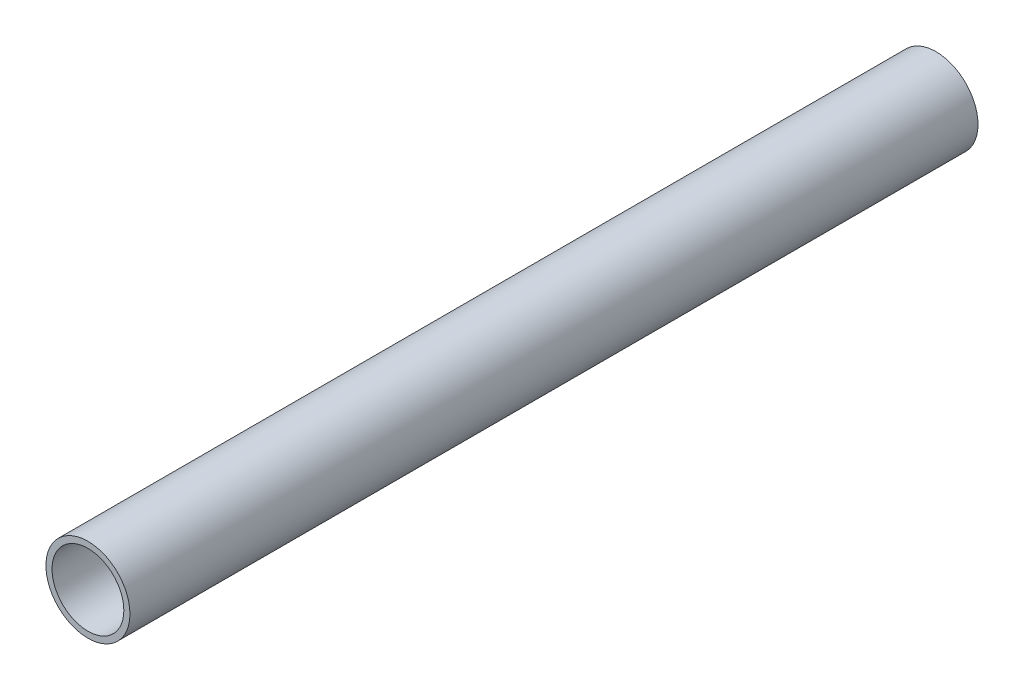
ISO-10303-21;
HEADER;
FILE_DESCRIPTION(('STEP AP214'),'2;1');
FILE_NAME('part.step','',(''),(''),'','','');
FILE_SCHEMA(('AUTOMOTIVE_DESIGN { 1 0 10303 214 1 1 1 1 }'));
ENDSEC;
DATA;
#1=APPLICATION_CONTEXT('core data for automotive mechanical design processes');
#2=APPLICATION_PROTOCOL_DEFINITION('international standard','automotive_design',2000,#1);
#3=PRODUCT_CONTEXT('',#1,'mechanical');
#4=PRODUCT('Part','Part','',(#3));
#5=PRODUCT_RELATED_PRODUCT_CATEGORY('part','',(#4));
#6=PRODUCT_DEFINITION_FORMATION('','',#4);
#7=PRODUCT_DEFINITION_CONTEXT('part definition',#1,'design');
#8=PRODUCT_DEFINITION('design','',#6,#7);
#9=PRODUCT_DEFINITION_SHAPE('','',#8);
#10=(LENGTH_UNIT() NAMED_UNIT(*) SI_UNIT(.MILLI.,.METRE.));
#11=(NAMED_UNIT(*) PLANE_ANGLE_UNIT() SI_UNIT($,.RADIAN.));
#12=(NAMED_UNIT(*) SI_UNIT($,.STERADIAN.) SOLID_ANGLE_UNIT());
#13=UNCERTAINTY_MEASURE_WITH_UNIT(LENGTH_MEASURE(1.E-05),#10,'distance_accuracy_value','');
#14=(GEOMETRIC_REPRESENTATION_CONTEXT(3) GLOBAL_UNCERTAINTY_ASSIGNED_CONTEXT((#13)) GLOBAL_UNIT_ASSIGNED_CONTEXT((#10,
#11,#12)) REPRESENTATION_CONTEXT('',''));
#15=CARTESIAN_POINT('',(0.,0.,0.));
#16=DIRECTION('',(0.,0.,1.));
#17=DIRECTION('',(1.,0.,0.));
#18=AXIS2_PLACEMENT_3D('',#15,#16,#17);
#19=CARTESIAN_POINT('',(0.,0.,600.));
#20=DIRECTION('',(0.,0.,1.));
#21=DIRECTION('',(1.,0.,0.));
#22=AXIS2_PLACEMENT_3D('',#19,#20,#21);
#23=PLANE('',#22);
#24=CARTESIAN_POINT('',(0.,0.,600.));
#25=DIRECTION('',(0.,0.,1.));
#26=DIRECTION('',(1.,0.,0.));
#27=AXIS2_PLACEMENT_3D('',#24,#25,#26);
#28=CIRCLE('',#27,29.72);
#29=CARTESIAN_POINT('',(29.72,0.,600.));
#30=VERTEX_POINT('',#29);
#31=EDGE_CURVE('E10',#30,#30,#28,.T.);
#32=ORIENTED_EDGE('',*,*,#31,.T.);
#33=EDGE_LOOP('',(#32));
#34=FACE_BOUND('',#33,.T.);
#35=CARTESIAN_POINT('',(0.,0.,600.));
#36=DIRECTION('',(0.,0.,1.));
#37=DIRECTION('',(1.,0.,0.));
#38=AXIS2_PLACEMENT_3D('',#35,#36,#37);
#39=CIRCLE('',#38,25.4);
#40=CARTESIAN_POINT('',(25.4,0.,600.));
#41=VERTEX_POINT('',#40);
#42=EDGE_CURVE('E48',#41,#41,#39,.T.);
#43=ORIENTED_EDGE('',*,*,#42,.F.);
#44=EDGE_LOOP('',(#43));
#45=FACE_BOUND('',#44,.T.);
#46=ADVANCED_FACE('F37',(#34,#45),#23,.T.);
#47=CARTESIAN_POINT('',(0.,0.,0.));
#48=DIRECTION('',(0.,0.,1.));
#49=DIRECTION('',(1.,0.,0.));
#50=AXIS2_PLACEMENT_3D('',#47,#48,#49);
#51=PLANE('',#50);
#52=CARTESIAN_POINT('',(0.,0.,0.));
#53=DIRECTION('',(0.,0.,1.));
#54=DIRECTION('',(1.,0.,0.));
#55=AXIS2_PLACEMENT_3D('',#52,#53,#54);
#56=CIRCLE('',#55,29.72);
#57=CARTESIAN_POINT('',(29.72,0.,0.));
#58=VERTEX_POINT('',#57);
#59=EDGE_CURVE('E41',#58,#58,#56,.T.);
#60=ORIENTED_EDGE('',*,*,#59,.F.);
#61=EDGE_LOOP('',(#60));
#62=FACE_BOUND('',#61,.T.);
#63=CARTESIAN_POINT('',(0.,0.,0.));
#64=DIRECTION('',(0.,0.,1.));
#65=DIRECTION('',(1.,0.,0.));
#66=AXIS2_PLACEMENT_3D('',#63,#64,#65);
#67=CIRCLE('',#66,25.4);
#68=CARTESIAN_POINT('',(25.4,0.,0.));
#69=VERTEX_POINT('',#68);
#70=EDGE_CURVE('E50',#69,#69,#67,.T.);
#71=ORIENTED_EDGE('',*,*,#70,.T.);
#72=EDGE_LOOP('',(#71));
#73=FACE_BOUND('',#72,.T.);
#74=ADVANCED_FACE('F60',(#62,#73),#51,.F.);
#75=CARTESIAN_POINT('',(0.,0.,600.));
#76=DIRECTION('',(0.,0.,-1.));
#77=DIRECTION('',(-1.,0.,0.));
#78=AXIS2_PLACEMENT_3D('',#75,#76,#77);
#79=CYLINDRICAL_SURFACE('',#78,29.72);
#80=ORIENTED_EDGE('',*,*,#31,.F.);
#81=EDGE_LOOP('',(#80));
#82=FACE_BOUND('',#81,.T.);
#83=ORIENTED_EDGE('',*,*,#59,.T.);
#84=EDGE_LOOP('',(#83));
#85=FACE_BOUND('',#84,.T.);
#86=ADVANCED_FACE('F39',(#82,#85),#79,.T.);
#87=CARTESIAN_POINT('',(0.,0.,600.));
#88=DIRECTION('',(0.,0.,-1.));
#89=DIRECTION('',(-1.,0.,0.));
#90=AXIS2_PLACEMENT_3D('',#87,#88,#89);
#91=CYLINDRICAL_SURFACE('',#90,25.4);
#92=ORIENTED_EDGE('',*,*,#42,.T.);
#93=EDGE_LOOP('',(#92));
#94=FACE_BOUND('',#93,.T.);
#95=ORIENTED_EDGE('',*,*,#70,.F.);
#96=EDGE_LOOP('',(#95));
#97=FACE_BOUND('',#96,.T.);
#98=ADVANCED_FACE('F56',(#94,#97),#91,.F.);
#99=CLOSED_SHELL('',(#46,#74,#86,#98));
#100=MANIFOLD_SOLID_BREP('B2',#99);
#101=ADVANCED_BREP_SHAPE_REPRESENTATION('',(#18,#100),#14);
#102=SHAPE_DEFINITION_REPRESENTATION(#9,#101);
ENDSEC;
END-ISO-10303-21;
